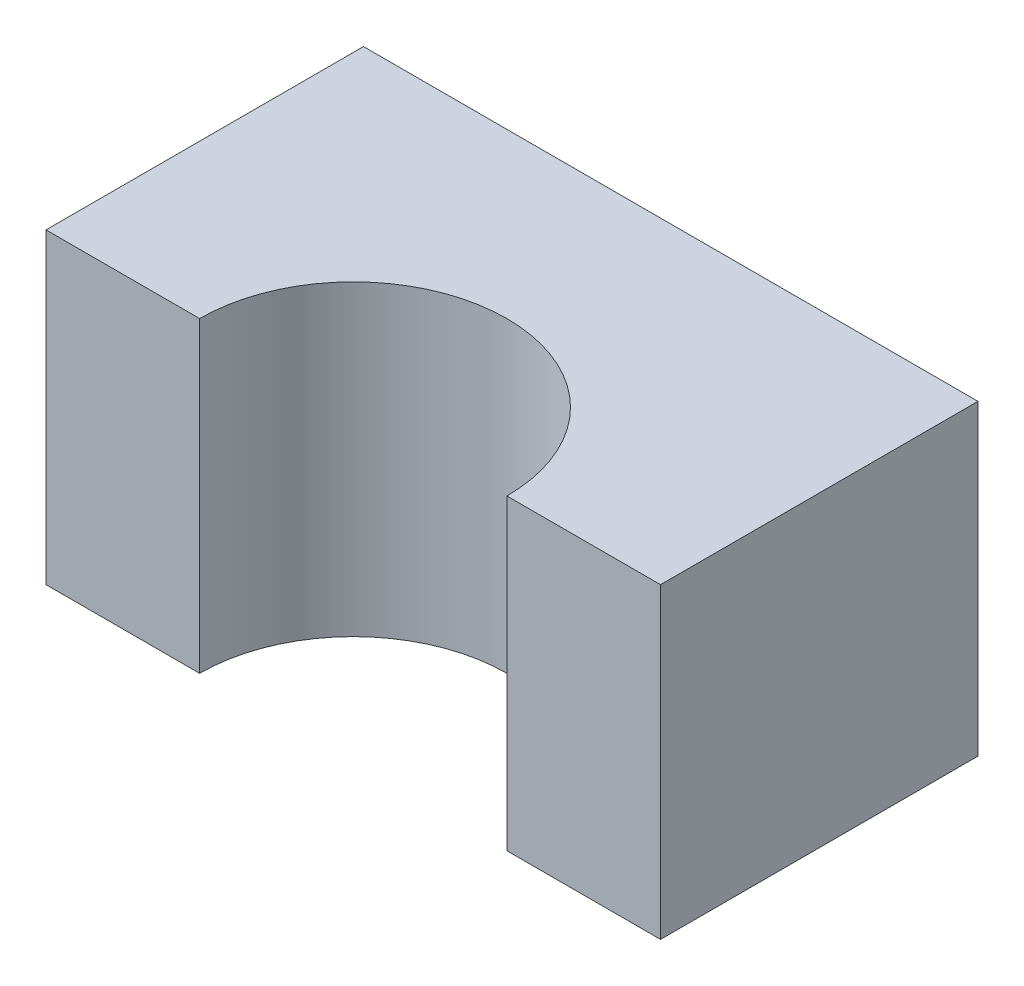
ISO-10303-21;
HEADER;
FILE_DESCRIPTION(('STEP AP214'),'2;1');
FILE_NAME('part.step','',(''),(''),'','','');
FILE_SCHEMA(('AUTOMOTIVE_DESIGN { 1 0 10303 214 1 1 1 1 }'));
ENDSEC;
DATA;
#1=APPLICATION_CONTEXT('core data for automotive mechanical design processes');
#2=APPLICATION_PROTOCOL_DEFINITION('international standard','automotive_design',2000,#1);
#3=PRODUCT_CONTEXT('',#1,'mechanical');
#4=PRODUCT('Part','Part','',(#3));
#5=PRODUCT_RELATED_PRODUCT_CATEGORY('part','',(#4));
#6=PRODUCT_DEFINITION_FORMATION('','',#4);
#7=PRODUCT_DEFINITION_CONTEXT('part definition',#1,'design');
#8=PRODUCT_DEFINITION('design','',#6,#7);
#9=PRODUCT_DEFINITION_SHAPE('','',#8);
#10=(LENGTH_UNIT() NAMED_UNIT(*) SI_UNIT(.MILLI.,.METRE.));
#11=(NAMED_UNIT(*) PLANE_ANGLE_UNIT() SI_UNIT($,.RADIAN.));
#12=(NAMED_UNIT(*) SI_UNIT($,.STERADIAN.) SOLID_ANGLE_UNIT());
#13=UNCERTAINTY_MEASURE_WITH_UNIT(LENGTH_MEASURE(1.E-05),#10,'distance_accuracy_value','');
#14=(GEOMETRIC_REPRESENTATION_CONTEXT(3) GLOBAL_UNCERTAINTY_ASSIGNED_CONTEXT((#13)) GLOBAL_UNIT_ASSIGNED_CONTEXT((#10,
#11,#12)) REPRESENTATION_CONTEXT('',''));
#15=CARTESIAN_POINT('',(0.,0.,0.));
#16=DIRECTION('',(0.,0.,1.));
#17=DIRECTION('',(1.,0.,0.));
#18=AXIS2_PLACEMENT_3D('',#15,#16,#17);
#19=CARTESIAN_POINT('',(0.,0.,3.1));
#20=DIRECTION('',(0.,0.,1.));
#21=DIRECTION('',(1.,0.,0.));
#22=AXIS2_PLACEMENT_3D('',#19,#20,#21);
#23=PLANE('',#22);
#24=DIRECTION('',(0.,1.,0.));
#25=VECTOR('',#24,1.);
#26=CARTESIAN_POINT('',(-20.607679987967,15.0160417276206,3.1));
#27=LINE('',#26,#25);
#28=CARTESIAN_POINT('',(-20.607679987967,21.0160417276206,3.1));
#29=VERTEX_POINT('',#28);
#30=CARTESIAN_POINT('',(-20.607679987967,24.0160417276206,3.1));
#31=VERTEX_POINT('',#30);
#32=EDGE_CURVE('E11',#29,#31,#27,.T.);
#33=ORIENTED_EDGE('',*,*,#32,.F.);
#34=DIRECTION('',(1.,0.,0.));
#35=VECTOR('',#34,1.);
#36=CARTESIAN_POINT('',(-25.107679987967,21.0160417276206,3.1));
#37=LINE('',#36,#35);
#38=CARTESIAN_POINT('',(-19.107679987967,21.0160417276206,3.1));
#39=VERTEX_POINT('',#38);
#40=EDGE_CURVE('E129',#29,#39,#37,.T.);
#41=ORIENTED_EDGE('',*,*,#40,.T.);
#42=DIRECTION('',(0.,1.,0.));
#43=VECTOR('',#42,1.);
#44=CARTESIAN_POINT('',(-19.107679987967,24.0160417276206,3.1));
#45=LINE('',#44,#43);
#46=CARTESIAN_POINT('',(-19.107679987967,24.0160417276206,3.1));
#47=VERTEX_POINT('',#46);
#48=EDGE_CURVE('E104',#39,#47,#45,.T.);
#49=ORIENTED_EDGE('',*,*,#48,.T.);
#50=DIRECTION('',(-1.,0.,0.));
#51=VECTOR('',#50,1.);
#52=CARTESIAN_POINT('',(-25.107679987967,24.0160417276206,3.1));
#53=LINE('',#52,#51);
#54=EDGE_CURVE('E101',#47,#31,#53,.T.);
#55=ORIENTED_EDGE('',*,*,#54,.T.);
#56=EDGE_LOOP('',(#33,#41,#49,#55));
#57=FACE_BOUND('',#56,.T.);
#58=ADVANCED_FACE('F33',(#57),#23,.T.);
#59=CARTESIAN_POINT('',(-25.107679987967,24.0160417276206,3.1));
#60=DIRECTION('',(1.,0.,0.));
#61=DIRECTION('',(0.,0.,-1.));
#62=AXIS2_PLACEMENT_3D('',#59,#60,#61);
#63=PLANE('',#62);
#64=DIRECTION('',(0.,-1.,0.));
#65=VECTOR('',#64,1.);
#66=CARTESIAN_POINT('',(-25.107679987967,24.0160417276206,0.));
#67=LINE('',#66,#65);
#68=CARTESIAN_POINT('',(-25.107679987967,24.0160417276206,0.));
#69=VERTEX_POINT('',#68);
#70=CARTESIAN_POINT('',(-25.107679987967,21.0160417276206,0.));
#71=VERTEX_POINT('',#70);
#72=EDGE_CURVE('E113',#69,#71,#67,.T.);
#73=ORIENTED_EDGE('',*,*,#72,.T.);
#74=DIRECTION('',(0.,0.,-1.));
#75=VECTOR('',#74,1.);
#76=CARTESIAN_POINT('',(-25.107679987967,21.0160417276206,3.1));
#77=LINE('',#76,#75);
#78=CARTESIAN_POINT('',(-25.107679987967,21.0160417276206,3.1));
#79=VERTEX_POINT('',#78);
#80=EDGE_CURVE('E126',#79,#71,#77,.T.);
#81=ORIENTED_EDGE('',*,*,#80,.F.);
#82=DIRECTION('',(0.,-1.,0.));
#83=VECTOR('',#82,1.);
#84=CARTESIAN_POINT('',(-25.107679987967,24.0160417276206,3.1));
#85=LINE('',#84,#83);
#86=CARTESIAN_POINT('',(-25.107679987967,24.0160417276206,3.1));
#87=VERTEX_POINT('',#86);
#88=EDGE_CURVE('E120',#87,#79,#85,.T.);
#89=ORIENTED_EDGE('',*,*,#88,.F.);
#90=DIRECTION('',(0.,0.,-1.));
#91=VECTOR('',#90,1.);
#92=CARTESIAN_POINT('',(-25.107679987967,24.0160417276206,3.1));
#93=LINE('',#92,#91);
#94=EDGE_CURVE('E106',#87,#69,#93,.T.);
#95=ORIENTED_EDGE('',*,*,#94,.T.);
#96=EDGE_LOOP('',(#73,#81,#89,#95));
#97=FACE_BOUND('',#96,.T.);
#98=ADVANCED_FACE('F35',(#97),#63,.F.);
#99=CARTESIAN_POINT('',(-25.107679987967,21.0160417276206,3.1));
#100=DIRECTION('',(0.,1.,0.));
#101=DIRECTION('',(0.,0.,1.));
#102=AXIS2_PLACEMENT_3D('',#99,#100,#101);
#103=PLANE('',#102);
#104=ORIENTED_EDGE('',*,*,#40,.F.);
#105=CARTESIAN_POINT('',(-22.107679987967,21.0160417276206,3.1));
#106=DIRECTION('',(0.,1.,0.));
#107=DIRECTION('',(0.,0.,1.));
#108=AXIS2_PLACEMENT_3D('',#105,#106,#107);
#109=CIRCLE('',#108,1.5);
#110=CARTESIAN_POINT('',(-23.607679987967,21.0160417276206,3.1));
#111=VERTEX_POINT('',#110);
#112=EDGE_CURVE('E95',#29,#111,#109,.T.);
#113=ORIENTED_EDGE('',*,*,#112,.T.);
#114=EDGE_CURVE('E85',#79,#111,#37,.T.);
#115=ORIENTED_EDGE('',*,*,#114,.F.);
#116=ORIENTED_EDGE('',*,*,#80,.T.);
#117=DIRECTION('',(1.,0.,0.));
#118=VECTOR('',#117,1.);
#119=CARTESIAN_POINT('',(-25.107679987967,21.0160417276206,0.));
#120=LINE('',#119,#118);
#121=CARTESIAN_POINT('',(-19.107679987967,21.0160417276206,0.));
#122=VERTEX_POINT('',#121);
#123=EDGE_CURVE('E116',#71,#122,#120,.T.);
#124=ORIENTED_EDGE('',*,*,#123,.T.);
#125=DIRECTION('',(0.,0.,-1.));
#126=VECTOR('',#125,1.);
#127=CARTESIAN_POINT('',(-19.107679987967,21.0160417276206,3.1));
#128=LINE('',#127,#126);
#129=EDGE_CURVE('E123',#39,#122,#128,.T.);
#130=ORIENTED_EDGE('',*,*,#129,.F.);
#131=EDGE_LOOP('',(#104,#113,#115,#116,#124,#130));
#132=FACE_BOUND('',#131,.T.);
#133=ADVANCED_FACE('F127',(#132),#103,.F.);
#134=CARTESIAN_POINT('',(-19.107679987967,24.0160417276206,3.1));
#135=DIRECTION('',(-1.,0.,0.));
#136=DIRECTION('',(0.,0.,1.));
#137=AXIS2_PLACEMENT_3D('',#134,#135,#136);
#138=PLANE('',#137);
#139=DIRECTION('',(0.,1.,0.));
#140=VECTOR('',#139,1.);
#141=CARTESIAN_POINT('',(-19.107679987967,24.0160417276206,0.));
#142=LINE('',#141,#140);
#143=CARTESIAN_POINT('',(-19.107679987967,24.0160417276206,0.));
#144=VERTEX_POINT('',#143);
#145=EDGE_CURVE('E118',#122,#144,#142,.T.);
#146=ORIENTED_EDGE('',*,*,#145,.T.);
#147=DIRECTION('',(0.,0.,-1.));
#148=VECTOR('',#147,1.);
#149=CARTESIAN_POINT('',(-19.107679987967,24.0160417276206,3.1));
#150=LINE('',#149,#148);
#151=EDGE_CURVE('E108',#47,#144,#150,.T.);
#152=ORIENTED_EDGE('',*,*,#151,.F.);
#153=ORIENTED_EDGE('',*,*,#48,.F.);
#154=ORIENTED_EDGE('',*,*,#129,.T.);
#155=EDGE_LOOP('',(#146,#152,#153,#154));
#156=FACE_BOUND('',#155,.T.);
#157=ADVANCED_FACE('F137',(#156),#138,.F.);
#158=CARTESIAN_POINT('',(-25.107679987967,24.0160417276206,3.1));
#159=DIRECTION('',(0.,-1.,0.));
#160=DIRECTION('',(0.,0.,-1.));
#161=AXIS2_PLACEMENT_3D('',#158,#159,#160);
#162=PLANE('',#161);
#163=CARTESIAN_POINT('',(-23.607679987967,24.0160417276206,3.1));
#164=VERTEX_POINT('',#163);
#165=EDGE_CURVE('E55',#164,#87,#53,.T.);
#166=ORIENTED_EDGE('',*,*,#165,.F.);
#167=CARTESIAN_POINT('',(-22.107679987967,24.0160417276206,3.1));
#168=DIRECTION('',(0.,1.,0.));
#169=DIRECTION('',(0.,0.,1.));
#170=AXIS2_PLACEMENT_3D('',#167,#168,#169);
#171=CIRCLE('',#170,1.5);
#172=EDGE_CURVE('E47',#31,#164,#171,.T.);
#173=ORIENTED_EDGE('',*,*,#172,.F.);
#174=ORIENTED_EDGE('',*,*,#54,.F.);
#175=ORIENTED_EDGE('',*,*,#151,.T.);
#176=DIRECTION('',(-1.,0.,0.));
#177=VECTOR('',#176,1.);
#178=CARTESIAN_POINT('',(-25.107679987967,24.0160417276206,0.));
#179=LINE('',#178,#177);
#180=EDGE_CURVE('E77',#144,#69,#179,.T.);
#181=ORIENTED_EDGE('',*,*,#180,.T.);
#182=ORIENTED_EDGE('',*,*,#94,.F.);
#183=EDGE_LOOP('',(#166,#173,#174,#175,#181,#182));
#184=FACE_BOUND('',#183,.T.);
#185=ADVANCED_FACE('F100',(#184),#162,.F.);
#186=DIRECTION('',(0.,1.,0.));
#187=VECTOR('',#186,1.);
#188=CARTESIAN_POINT('',(-23.607679987967,15.0160417276206,3.1));
#189=LINE('',#188,#187);
#190=EDGE_CURVE('E41',#164,#111,#189,.F.);
#191=ORIENTED_EDGE('',*,*,#190,.F.);
#192=ORIENTED_EDGE('',*,*,#165,.T.);
#193=ORIENTED_EDGE('',*,*,#88,.T.);
#194=ORIENTED_EDGE('',*,*,#114,.T.);
#195=EDGE_LOOP('',(#191,#192,#193,#194));
#196=FACE_BOUND('',#195,.T.);
#197=ADVANCED_FACE('F131',(#196),#23,.T.);
#198=CARTESIAN_POINT('',(0.,0.,0.));
#199=DIRECTION('',(0.,0.,1.));
#200=DIRECTION('',(1.,0.,0.));
#201=AXIS2_PLACEMENT_3D('',#198,#199,#200);
#202=PLANE('',#201);
#203=ORIENTED_EDGE('',*,*,#72,.F.);
#204=ORIENTED_EDGE('',*,*,#180,.F.);
#205=ORIENTED_EDGE('',*,*,#145,.F.);
#206=ORIENTED_EDGE('',*,*,#123,.F.);
#207=EDGE_LOOP('',(#203,#204,#205,#206));
#208=FACE_BOUND('',#207,.T.);
#209=ADVANCED_FACE('F140',(#208),#202,.F.);
#210=CARTESIAN_POINT('',(-22.107679987967,15.0160417276206,3.1));
#211=DIRECTION('',(0.,1.,0.));
#212=DIRECTION('',(0.,0.,1.));
#213=AXIS2_PLACEMENT_3D('',#210,#211,#212);
#214=CYLINDRICAL_SURFACE('',#213,1.5);
#215=ORIENTED_EDGE('',*,*,#32,.T.);
#216=ORIENTED_EDGE('',*,*,#172,.T.);
#217=ORIENTED_EDGE('',*,*,#190,.T.);
#218=ORIENTED_EDGE('',*,*,#112,.F.);
#219=EDGE_LOOP('',(#215,#216,#217,#218));
#220=FACE_BOUND('',#219,.T.);
#221=ADVANCED_FACE('F94',(#220),#214,.F.);
#222=CLOSED_SHELL('',(#58,#98,#133,#157,#185,#197,#209,#221));
#223=MANIFOLD_SOLID_BREP('B2',#222);
#224=ADVANCED_BREP_SHAPE_REPRESENTATION('',(#18,#223),#14);
#225=SHAPE_DEFINITION_REPRESENTATION(#9,#224);
ENDSEC;
END-ISO-10303-21;
